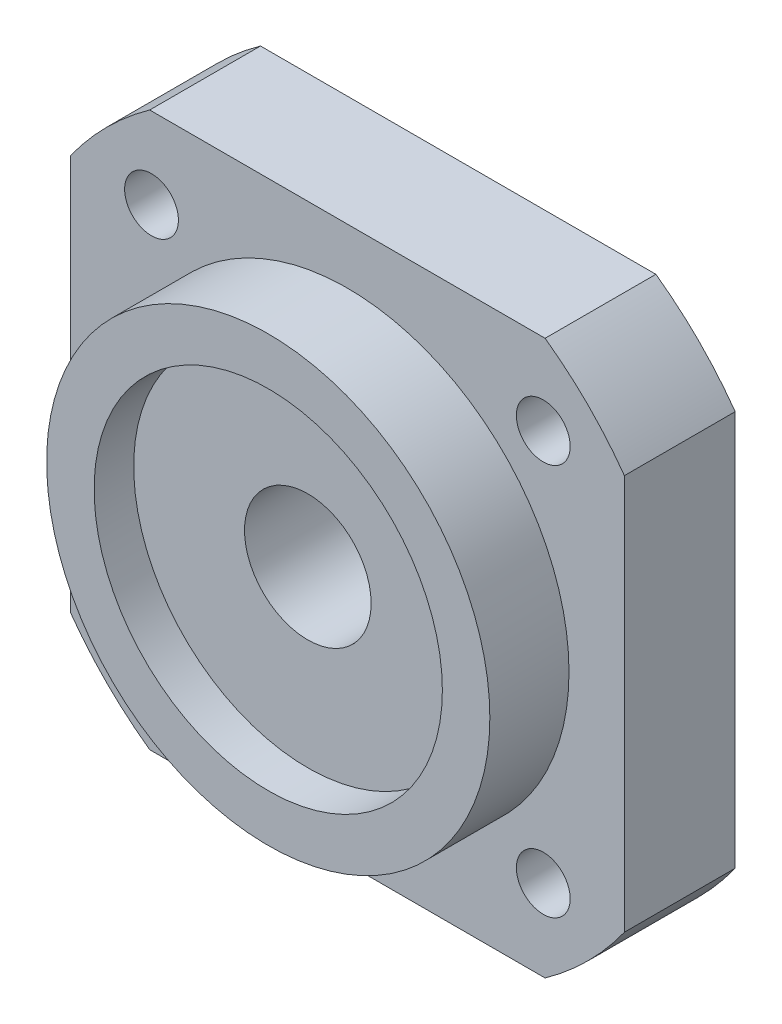
ISO-10303-21;
HEADER;
FILE_DESCRIPTION(('STEP AP214'),'2;1');
FILE_NAME('part.step','',(''),(''),'','','');
FILE_SCHEMA(('AUTOMOTIVE_DESIGN { 1 0 10303 214 1 1 1 1 }'));
ENDSEC;
DATA;
#1=APPLICATION_CONTEXT('core data for automotive mechanical design processes');
#2=APPLICATION_PROTOCOL_DEFINITION('international standard','automotive_design',2000,#1);
#3=PRODUCT_CONTEXT('',#1,'mechanical');
#4=PRODUCT('Part','Part','',(#3));
#5=PRODUCT_RELATED_PRODUCT_CATEGORY('part','',(#4));
#6=PRODUCT_DEFINITION_FORMATION('','',#4);
#7=PRODUCT_DEFINITION_CONTEXT('part definition',#1,'design');
#8=PRODUCT_DEFINITION('design','',#6,#7);
#9=PRODUCT_DEFINITION_SHAPE('','',#8);
#10=(LENGTH_UNIT() NAMED_UNIT(*) SI_UNIT(.MILLI.,.METRE.));
#11=(NAMED_UNIT(*) PLANE_ANGLE_UNIT() SI_UNIT($,.RADIAN.));
#12=(NAMED_UNIT(*) SI_UNIT($,.STERADIAN.) SOLID_ANGLE_UNIT());
#13=UNCERTAINTY_MEASURE_WITH_UNIT(LENGTH_MEASURE(1.E-05),#10,'distance_accuracy_value','');
#14=(GEOMETRIC_REPRESENTATION_CONTEXT(3) GLOBAL_UNCERTAINTY_ASSIGNED_CONTEXT((#13)) GLOBAL_UNIT_ASSIGNED_CONTEXT((#10,
#11,#12)) REPRESENTATION_CONTEXT('',''));
#15=CARTESIAN_POINT('',(0.,0.,0.));
#16=DIRECTION('',(0.,0.,1.));
#17=DIRECTION('',(1.,0.,0.));
#18=AXIS2_PLACEMENT_3D('',#15,#16,#17);
#19=CARTESIAN_POINT('',(0.,0.,7.));
#20=DIRECTION('',(0.,0.,-1.));
#21=DIRECTION('',(-1.,0.,0.));
#22=AXIS2_PLACEMENT_3D('',#19,#20,#21);
#23=CYLINDRICAL_SURFACE('',#22,21.5);
#24=CARTESIAN_POINT('',(0.,0.,0.));
#25=DIRECTION('',(0.,0.,-1.));
#26=DIRECTION('',(-1.,0.,0.));
#27=AXIS2_PLACEMENT_3D('',#24,#25,#26);
#28=CIRCLE('',#27,21.5);
#29=CARTESIAN_POINT('',(12.4899959967968,17.5,0.));
#30=VERTEX_POINT('',#29);
#31=CARTESIAN_POINT('',(17.5,12.4899959967968,0.));
#32=VERTEX_POINT('',#31);
#33=EDGE_CURVE('E132',#30,#32,#28,.T.);
#34=ORIENTED_EDGE('',*,*,#33,.F.);
#35=DIRECTION('',(0.,0.,-1.));
#36=VECTOR('',#35,1.);
#37=CARTESIAN_POINT('',(12.4899959967968,17.5,7.));
#38=LINE('',#37,#36);
#39=CARTESIAN_POINT('',(12.4899959967968,17.5,7.));
#40=VERTEX_POINT('',#39);
#41=EDGE_CURVE('E41',#40,#30,#38,.T.);
#42=ORIENTED_EDGE('',*,*,#41,.F.);
#43=CARTESIAN_POINT('',(0.,0.,7.));
#44=DIRECTION('',(0.,0.,-1.));
#45=DIRECTION('',(-1.,0.,0.));
#46=AXIS2_PLACEMENT_3D('',#43,#44,#45);
#47=CIRCLE('',#46,21.5);
#48=CARTESIAN_POINT('',(17.5,12.4899959967968,7.));
#49=VERTEX_POINT('',#48);
#50=EDGE_CURVE('E154',#40,#49,#47,.T.);
#51=ORIENTED_EDGE('',*,*,#50,.T.);
#52=DIRECTION('',(0.,0.,-1.));
#53=VECTOR('',#52,1.);
#54=CARTESIAN_POINT('',(17.5,12.4899959967968,7.));
#55=LINE('',#54,#53);
#56=EDGE_CURVE('E90',#49,#32,#55,.T.);
#57=ORIENTED_EDGE('',*,*,#56,.T.);
#58=EDGE_LOOP('',(#34,#42,#51,#57));
#59=FACE_BOUND('',#58,.T.);
#60=ADVANCED_FACE('F32',(#59),#23,.T.);
#61=CARTESIAN_POINT('',(-12.4899959967968,17.5,7.));
#62=DIRECTION('',(0.,1.,0.));
#63=DIRECTION('',(-1.,0.,0.));
#64=AXIS2_PLACEMENT_3D('',#61,#62,#63);
#65=PLANE('',#64);
#66=DIRECTION('',(1.,0.,0.));
#67=VECTOR('',#66,1.);
#68=CARTESIAN_POINT('',(-12.4899959967968,17.5,0.));
#69=LINE('',#68,#67);
#70=CARTESIAN_POINT('',(-12.4899959967968,17.5,0.));
#71=VERTEX_POINT('',#70);
#72=EDGE_CURVE('E151',#71,#30,#69,.T.);
#73=ORIENTED_EDGE('',*,*,#72,.F.);
#74=DIRECTION('',(0.,0.,-1.));
#75=VECTOR('',#74,1.);
#76=CARTESIAN_POINT('',(-12.4899959967968,17.5,7.));
#77=LINE('',#76,#75);
#78=CARTESIAN_POINT('',(-12.4899959967968,17.5,7.));
#79=VERTEX_POINT('',#78);
#80=EDGE_CURVE('E78',#79,#71,#77,.T.);
#81=ORIENTED_EDGE('',*,*,#80,.F.);
#82=DIRECTION('',(1.,0.,0.));
#83=VECTOR('',#82,1.);
#84=CARTESIAN_POINT('',(-12.4899959967968,17.5,7.));
#85=LINE('',#84,#83);
#86=EDGE_CURVE('E122',#79,#40,#85,.T.);
#87=ORIENTED_EDGE('',*,*,#86,.T.);
#88=ORIENTED_EDGE('',*,*,#41,.T.);
#89=EDGE_LOOP('',(#73,#81,#87,#88));
#90=FACE_BOUND('',#89,.T.);
#91=ADVANCED_FACE('F241',(#90),#65,.T.);
#92=CARTESIAN_POINT('',(0.,0.,7.));
#93=DIRECTION('',(0.,0.,-1.));
#94=DIRECTION('',(-1.,0.,0.));
#95=AXIS2_PLACEMENT_3D('',#92,#93,#94);
#96=CYLINDRICAL_SURFACE('',#95,21.5);
#97=CARTESIAN_POINT('',(0.,0.,0.));
#98=DIRECTION('',(0.,0.,-1.));
#99=DIRECTION('',(-1.,0.,0.));
#100=AXIS2_PLACEMENT_3D('',#97,#98,#99);
#101=CIRCLE('',#100,21.5);
#102=CARTESIAN_POINT('',(-17.5,12.4899959967968,0.));
#103=VERTEX_POINT('',#102);
#104=EDGE_CURVE('E109',#103,#71,#101,.T.);
#105=ORIENTED_EDGE('',*,*,#104,.F.);
#106=DIRECTION('',(0.,0.,-1.));
#107=VECTOR('',#106,1.);
#108=CARTESIAN_POINT('',(-17.5,12.4899959967968,7.));
#109=LINE('',#108,#107);
#110=CARTESIAN_POINT('',(-17.5,12.4899959967968,7.));
#111=VERTEX_POINT('',#110);
#112=EDGE_CURVE('E104',#111,#103,#109,.T.);
#113=ORIENTED_EDGE('',*,*,#112,.F.);
#114=CARTESIAN_POINT('',(0.,0.,7.));
#115=DIRECTION('',(0.,0.,-1.));
#116=DIRECTION('',(-1.,0.,0.));
#117=AXIS2_PLACEMENT_3D('',#114,#115,#116);
#118=CIRCLE('',#117,21.5);
#119=EDGE_CURVE('E107',#111,#79,#118,.T.);
#120=ORIENTED_EDGE('',*,*,#119,.T.);
#121=ORIENTED_EDGE('',*,*,#80,.T.);
#122=EDGE_LOOP('',(#105,#113,#120,#121));
#123=FACE_BOUND('',#122,.T.);
#124=ADVANCED_FACE('F106',(#123),#96,.T.);
#125=CARTESIAN_POINT('',(-17.5,-12.4899959967968,7.));
#126=DIRECTION('',(-1.,0.,0.));
#127=DIRECTION('',(0.,-1.,0.));
#128=AXIS2_PLACEMENT_3D('',#125,#126,#127);
#129=PLANE('',#128);
#130=DIRECTION('',(0.,1.,0.));
#131=VECTOR('',#130,1.);
#132=CARTESIAN_POINT('',(-17.5,-12.4899959967968,0.));
#133=LINE('',#132,#131);
#134=CARTESIAN_POINT('',(-17.5,-12.4899959967968,0.));
#135=VERTEX_POINT('',#134);
#136=EDGE_CURVE('E148',#135,#103,#133,.T.);
#137=ORIENTED_EDGE('',*,*,#136,.F.);
#138=DIRECTION('',(0.,0.,-1.));
#139=VECTOR('',#138,1.);
#140=CARTESIAN_POINT('',(-17.5,-12.4899959967968,7.));
#141=LINE('',#140,#139);
#142=CARTESIAN_POINT('',(-17.5,-12.4899959967968,7.));
#143=VERTEX_POINT('',#142);
#144=EDGE_CURVE('E114',#143,#135,#141,.T.);
#145=ORIENTED_EDGE('',*,*,#144,.F.);
#146=DIRECTION('',(0.,1.,0.));
#147=VECTOR('',#146,1.);
#148=CARTESIAN_POINT('',(-17.5,-12.4899959967968,7.));
#149=LINE('',#148,#147);
#150=EDGE_CURVE('E120',#143,#111,#149,.T.);
#151=ORIENTED_EDGE('',*,*,#150,.T.);
#152=ORIENTED_EDGE('',*,*,#112,.T.);
#153=EDGE_LOOP('',(#137,#145,#151,#152));
#154=FACE_BOUND('',#153,.T.);
#155=ADVANCED_FACE('F124',(#154),#129,.T.);
#156=CARTESIAN_POINT('',(0.,0.,7.));
#157=DIRECTION('',(0.,0.,-1.));
#158=DIRECTION('',(-1.,0.,0.));
#159=AXIS2_PLACEMENT_3D('',#156,#157,#158);
#160=CYLINDRICAL_SURFACE('',#159,21.5);
#161=CARTESIAN_POINT('',(0.,0.,0.));
#162=DIRECTION('',(0.,0.,-1.));
#163=DIRECTION('',(-1.,0.,0.));
#164=AXIS2_PLACEMENT_3D('',#161,#162,#163);
#165=CIRCLE('',#164,21.5);
#166=CARTESIAN_POINT('',(-12.4899959967968,-17.5,0.));
#167=VERTEX_POINT('',#166);
#168=EDGE_CURVE('E145',#167,#135,#165,.T.);
#169=ORIENTED_EDGE('',*,*,#168,.F.);
#170=DIRECTION('',(0.,0.,-1.));
#171=VECTOR('',#170,1.);
#172=CARTESIAN_POINT('',(-12.4899959967968,-17.5,7.));
#173=LINE('',#172,#171);
#174=CARTESIAN_POINT('',(-12.4899959967968,-17.5,7.));
#175=VERTEX_POINT('',#174);
#176=EDGE_CURVE('E158',#175,#167,#173,.T.);
#177=ORIENTED_EDGE('',*,*,#176,.F.);
#178=CARTESIAN_POINT('',(0.,0.,7.));
#179=DIRECTION('',(0.,0.,-1.));
#180=DIRECTION('',(-1.,0.,0.));
#181=AXIS2_PLACEMENT_3D('',#178,#179,#180);
#182=CIRCLE('',#181,21.5);
#183=EDGE_CURVE('E125',#175,#143,#182,.T.);
#184=ORIENTED_EDGE('',*,*,#183,.T.);
#185=ORIENTED_EDGE('',*,*,#144,.T.);
#186=EDGE_LOOP('',(#169,#177,#184,#185));
#187=FACE_BOUND('',#186,.T.);
#188=ADVANCED_FACE('F254',(#187),#160,.T.);
#189=CARTESIAN_POINT('',(12.4899959967968,-17.5,7.));
#190=DIRECTION('',(0.,-1.,0.));
#191=DIRECTION('',(1.,0.,0.));
#192=AXIS2_PLACEMENT_3D('',#189,#190,#191);
#193=PLANE('',#192);
#194=DIRECTION('',(-1.,0.,0.));
#195=VECTOR('',#194,1.);
#196=CARTESIAN_POINT('',(12.4899959967968,-17.5,0.));
#197=LINE('',#196,#195);
#198=CARTESIAN_POINT('',(12.4899959967968,-17.5,0.));
#199=VERTEX_POINT('',#198);
#200=EDGE_CURVE('E142',#199,#167,#197,.T.);
#201=ORIENTED_EDGE('',*,*,#200,.F.);
#202=DIRECTION('',(0.,0.,-1.));
#203=VECTOR('',#202,1.);
#204=CARTESIAN_POINT('',(12.4899959967968,-17.5,7.));
#205=LINE('',#204,#203);
#206=CARTESIAN_POINT('',(12.4899959967968,-17.5,7.));
#207=VERTEX_POINT('',#206);
#208=EDGE_CURVE('E160',#207,#199,#205,.T.);
#209=ORIENTED_EDGE('',*,*,#208,.F.);
#210=DIRECTION('',(-1.,0.,0.));
#211=VECTOR('',#210,1.);
#212=CARTESIAN_POINT('',(12.4899959967968,-17.5,7.));
#213=LINE('',#212,#211);
#214=EDGE_CURVE('E127',#207,#175,#213,.T.);
#215=ORIENTED_EDGE('',*,*,#214,.T.);
#216=ORIENTED_EDGE('',*,*,#176,.T.);
#217=EDGE_LOOP('',(#201,#209,#215,#216));
#218=FACE_BOUND('',#217,.T.);
#219=ADVANCED_FACE('F232',(#218),#193,.T.);
#220=CARTESIAN_POINT('',(0.,0.,7.));
#221=DIRECTION('',(0.,0.,-1.));
#222=DIRECTION('',(-1.,0.,0.));
#223=AXIS2_PLACEMENT_3D('',#220,#221,#222);
#224=CYLINDRICAL_SURFACE('',#223,21.5);
#225=CARTESIAN_POINT('',(0.,0.,0.));
#226=DIRECTION('',(0.,0.,-1.));
#227=DIRECTION('',(-1.,0.,0.));
#228=AXIS2_PLACEMENT_3D('',#225,#226,#227);
#229=CIRCLE('',#228,21.5);
#230=CARTESIAN_POINT('',(17.5,-12.4899959967968,0.));
#231=VERTEX_POINT('',#230);
#232=EDGE_CURVE('E139',#231,#199,#229,.T.);
#233=ORIENTED_EDGE('',*,*,#232,.F.);
#234=DIRECTION('',(0.,0.,-1.));
#235=VECTOR('',#234,1.);
#236=CARTESIAN_POINT('',(17.5,-12.4899959967968,7.));
#237=LINE('',#236,#235);
#238=CARTESIAN_POINT('',(17.5,-12.4899959967968,7.));
#239=VERTEX_POINT('',#238);
#240=EDGE_CURVE('E162',#239,#231,#237,.T.);
#241=ORIENTED_EDGE('',*,*,#240,.F.);
#242=CARTESIAN_POINT('',(0.,0.,7.));
#243=DIRECTION('',(0.,0.,-1.));
#244=DIRECTION('',(-1.,0.,0.));
#245=AXIS2_PLACEMENT_3D('',#242,#243,#244);
#246=CIRCLE('',#245,21.5);
#247=EDGE_CURVE('E226',#239,#207,#246,.T.);
#248=ORIENTED_EDGE('',*,*,#247,.T.);
#249=ORIENTED_EDGE('',*,*,#208,.T.);
#250=EDGE_LOOP('',(#233,#241,#248,#249));
#251=FACE_BOUND('',#250,.T.);
#252=ADVANCED_FACE('F237',(#251),#224,.T.);
#253=CARTESIAN_POINT('',(17.5,12.4899959967968,7.));
#254=DIRECTION('',(1.,0.,0.));
#255=DIRECTION('',(0.,0.,-1.));
#256=AXIS2_PLACEMENT_3D('',#253,#254,#255);
#257=PLANE('',#256);
#258=DIRECTION('',(0.,-1.,0.));
#259=VECTOR('',#258,1.);
#260=CARTESIAN_POINT('',(17.5,12.4899959967968,0.));
#261=LINE('',#260,#259);
#262=EDGE_CURVE('E135',#32,#231,#261,.T.);
#263=ORIENTED_EDGE('',*,*,#262,.F.);
#264=ORIENTED_EDGE('',*,*,#56,.F.);
#265=DIRECTION('',(0.,-1.,0.));
#266=VECTOR('',#265,1.);
#267=CARTESIAN_POINT('',(17.5,12.4899959967968,7.));
#268=LINE('',#267,#266);
#269=EDGE_CURVE('E224',#49,#239,#268,.T.);
#270=ORIENTED_EDGE('',*,*,#269,.T.);
#271=ORIENTED_EDGE('',*,*,#240,.T.);
#272=EDGE_LOOP('',(#263,#264,#270,#271));
#273=FACE_BOUND('',#272,.T.);
#274=ADVANCED_FACE('F238',(#273),#257,.T.);
#275=CARTESIAN_POINT('',(0.,0.,7.));
#276=DIRECTION('',(0.,0.,-1.));
#277=DIRECTION('',(-1.,0.,0.));
#278=AXIS2_PLACEMENT_3D('',#275,#276,#277);
#279=PLANE('',#278);
#280=CARTESIAN_POINT('',(-12.374368670765,12.374368670765,7.));
#281=DIRECTION('',(0.,0.,-1.));
#282=DIRECTION('',(-1.,0.,0.));
#283=AXIS2_PLACEMENT_3D('',#280,#281,#282);
#284=CIRCLE('',#283,1.70000000000001);
#285=CARTESIAN_POINT('',(-14.074368670765,12.374368670765,7.));
#286=VERTEX_POINT('',#285);
#287=EDGE_CURVE('E35',#286,#286,#284,.T.);
#288=ORIENTED_EDGE('',*,*,#287,.T.);
#289=EDGE_LOOP('',(#288));
#290=FACE_BOUND('',#289,.T.);
#291=CARTESIAN_POINT('',(12.374368670765,12.374368670765,7.));
#292=DIRECTION('',(0.,0.,-1.));
#293=DIRECTION('',(-1.,0.,0.));
#294=AXIS2_PLACEMENT_3D('',#291,#292,#293);
#295=CIRCLE('',#294,1.70000000000001);
#296=CARTESIAN_POINT('',(10.674368670765,12.374368670765,7.));
#297=VERTEX_POINT('',#296);
#298=EDGE_CURVE('E174',#297,#297,#295,.T.);
#299=ORIENTED_EDGE('',*,*,#298,.T.);
#300=EDGE_LOOP('',(#299));
#301=FACE_BOUND('',#300,.T.);
#302=CARTESIAN_POINT('',(12.374368670765,-12.374368670765,7.));
#303=DIRECTION('',(0.,0.,-1.));
#304=DIRECTION('',(-1.,0.,0.));
#305=AXIS2_PLACEMENT_3D('',#302,#303,#304);
#306=CIRCLE('',#305,1.70000000000001);
#307=CARTESIAN_POINT('',(10.674368670765,-12.374368670765,7.));
#308=VERTEX_POINT('',#307);
#309=EDGE_CURVE('E170',#308,#308,#306,.T.);
#310=ORIENTED_EDGE('',*,*,#309,.T.);
#311=EDGE_LOOP('',(#310));
#312=FACE_BOUND('',#311,.T.);
#313=CARTESIAN_POINT('',(-12.374368670765,-12.374368670765,7.));
#314=DIRECTION('',(0.,0.,-1.));
#315=DIRECTION('',(-1.,0.,0.));
#316=AXIS2_PLACEMENT_3D('',#313,#314,#315);
#317=CIRCLE('',#316,1.70000000000001);
#318=CARTESIAN_POINT('',(-14.074368670765,-12.374368670765,7.));
#319=VERTEX_POINT('',#318);
#320=EDGE_CURVE('E165',#319,#319,#317,.T.);
#321=ORIENTED_EDGE('',*,*,#320,.T.);
#322=EDGE_LOOP('',(#321));
#323=FACE_BOUND('',#322,.T.);
#324=CARTESIAN_POINT('',(0.,0.,7.));
#325=DIRECTION('',(0.,0.,1.));
#326=DIRECTION('',(1.,0.,0.));
#327=AXIS2_PLACEMENT_3D('',#324,#325,#326);
#328=CIRCLE('',#327,14.);
#329=CARTESIAN_POINT('',(14.,0.,7.));
#330=VERTEX_POINT('',#329);
#331=EDGE_CURVE('E11',#330,#330,#328,.T.);
#332=ORIENTED_EDGE('',*,*,#331,.F.);
#333=EDGE_LOOP('',(#332));
#334=FACE_BOUND('',#333,.T.);
#335=ORIENTED_EDGE('',*,*,#50,.F.);
#336=ORIENTED_EDGE('',*,*,#86,.F.);
#337=ORIENTED_EDGE('',*,*,#119,.F.);
#338=ORIENTED_EDGE('',*,*,#150,.F.);
#339=ORIENTED_EDGE('',*,*,#183,.F.);
#340=ORIENTED_EDGE('',*,*,#214,.F.);
#341=ORIENTED_EDGE('',*,*,#247,.F.);
#342=ORIENTED_EDGE('',*,*,#269,.F.);
#343=EDGE_LOOP('',(#335,#336,#337,#338,#339,#340,#341,#342));
#344=FACE_BOUND('',#343,.T.);
#345=ADVANCED_FACE('F118',(#290,#301,#312,#323,#334,#344),#279,.F.);
#346=CARTESIAN_POINT('',(0.,0.,0.));
#347=DIRECTION('',(0.,0.,-1.));
#348=DIRECTION('',(-1.,0.,0.));
#349=AXIS2_PLACEMENT_3D('',#346,#347,#348);
#350=PLANE('',#349);
#351=CARTESIAN_POINT('',(-12.374368670765,12.374368670765,0.));
#352=DIRECTION('',(0.,0.,-1.));
#353=DIRECTION('',(-1.,0.,0.));
#354=AXIS2_PLACEMENT_3D('',#351,#352,#353);
#355=CIRCLE('',#354,2.99999999999999);
#356=CARTESIAN_POINT('',(-15.374368670765,12.374368670765,0.));
#357=VERTEX_POINT('',#356);
#358=EDGE_CURVE('E354',#357,#357,#355,.T.);
#359=ORIENTED_EDGE('',*,*,#358,.F.);
#360=EDGE_LOOP('',(#359));
#361=FACE_BOUND('',#360,.T.);
#362=CARTESIAN_POINT('',(12.374368670765,12.374368670765,0.));
#363=DIRECTION('',(0.,0.,-1.));
#364=DIRECTION('',(-1.,0.,0.));
#365=AXIS2_PLACEMENT_3D('',#362,#363,#364);
#366=CIRCLE('',#365,2.99999999999999);
#367=CARTESIAN_POINT('',(9.37436867076501,12.374368670765,0.));
#368=VERTEX_POINT('',#367);
#369=EDGE_CURVE('E189',#368,#368,#366,.T.);
#370=ORIENTED_EDGE('',*,*,#369,.F.);
#371=EDGE_LOOP('',(#370));
#372=FACE_BOUND('',#371,.T.);
#373=CARTESIAN_POINT('',(12.374368670765,-12.374368670765,0.));
#374=DIRECTION('',(0.,0.,-1.));
#375=DIRECTION('',(-1.,0.,0.));
#376=AXIS2_PLACEMENT_3D('',#373,#374,#375);
#377=CIRCLE('',#376,2.99999999999999);
#378=CARTESIAN_POINT('',(9.37436867076501,-12.374368670765,0.));
#379=VERTEX_POINT('',#378);
#380=EDGE_CURVE('E176',#379,#379,#377,.T.);
#381=ORIENTED_EDGE('',*,*,#380,.F.);
#382=EDGE_LOOP('',(#381));
#383=FACE_BOUND('',#382,.T.);
#384=CARTESIAN_POINT('',(-12.374368670765,-12.374368670765,0.));
#385=DIRECTION('',(0.,0.,-1.));
#386=DIRECTION('',(-1.,0.,0.));
#387=AXIS2_PLACEMENT_3D('',#384,#385,#386);
#388=CIRCLE('',#387,2.99999999999999);
#389=CARTESIAN_POINT('',(-15.374368670765,-12.374368670765,0.));
#390=VERTEX_POINT('',#389);
#391=EDGE_CURVE('E172',#390,#390,#388,.T.);
#392=ORIENTED_EDGE('',*,*,#391,.F.);
#393=EDGE_LOOP('',(#392));
#394=FACE_BOUND('',#393,.T.);
#395=CARTESIAN_POINT('',(0.,0.,0.));
#396=DIRECTION('',(0.,0.,1.));
#397=DIRECTION('',(1.,0.,0.));
#398=AXIS2_PLACEMENT_3D('',#395,#396,#397);
#399=CIRCLE('',#398,11.);
#400=CARTESIAN_POINT('',(11.,0.,0.));
#401=VERTEX_POINT('',#400);
#402=EDGE_CURVE('E218',#401,#401,#399,.T.);
#403=ORIENTED_EDGE('',*,*,#402,.T.);
#404=EDGE_LOOP('',(#403));
#405=FACE_BOUND('',#404,.T.);
#406=ORIENTED_EDGE('',*,*,#33,.T.);
#407=ORIENTED_EDGE('',*,*,#262,.T.);
#408=ORIENTED_EDGE('',*,*,#232,.T.);
#409=ORIENTED_EDGE('',*,*,#200,.T.);
#410=ORIENTED_EDGE('',*,*,#168,.T.);
#411=ORIENTED_EDGE('',*,*,#136,.T.);
#412=ORIENTED_EDGE('',*,*,#104,.T.);
#413=ORIENTED_EDGE('',*,*,#72,.T.);
#414=EDGE_LOOP('',(#406,#407,#408,#409,#410,#411,#412,#413));
#415=FACE_BOUND('',#414,.T.);
#416=ADVANCED_FACE('F240',(#361,#372,#383,#394,#405,#415),#350,.T.);
#417=CARTESIAN_POINT('',(0.,0.,7.));
#418=DIRECTION('',(0.,0.,1.));
#419=DIRECTION('',(1.,0.,0.));
#420=AXIS2_PLACEMENT_3D('',#417,#418,#419);
#421=CYLINDRICAL_SURFACE('',#420,14.);
#422=ORIENTED_EDGE('',*,*,#331,.T.);
#423=EDGE_LOOP('',(#422));
#424=FACE_BOUND('',#423,.T.);
#425=CARTESIAN_POINT('',(0.,0.,12.));
#426=DIRECTION('',(0.,0.,1.));
#427=DIRECTION('',(1.,0.,0.));
#428=AXIS2_PLACEMENT_3D('',#425,#426,#427);
#429=CIRCLE('',#428,14.);
#430=CARTESIAN_POINT('',(14.,0.,12.));
#431=VERTEX_POINT('',#430);
#432=EDGE_CURVE('E136',#431,#431,#429,.T.);
#433=ORIENTED_EDGE('',*,*,#432,.F.);
#434=EDGE_LOOP('',(#433));
#435=FACE_BOUND('',#434,.T.);
#436=ADVANCED_FACE('F269',(#424,#435),#421,.T.);
#437=CARTESIAN_POINT('',(0.,0.,12.));
#438=DIRECTION('',(0.,0.,1.));
#439=DIRECTION('',(1.,0.,0.));
#440=AXIS2_PLACEMENT_3D('',#437,#438,#439);
#441=PLANE('',#440);
#442=CARTESIAN_POINT('',(0.,0.,12.));
#443=DIRECTION('',(0.,0.,1.));
#444=DIRECTION('',(1.,0.,0.));
#445=AXIS2_PLACEMENT_3D('',#442,#443,#444);
#446=CIRCLE('',#445,11.);
#447=CARTESIAN_POINT('',(11.,0.,12.));
#448=VERTEX_POINT('',#447);
#449=EDGE_CURVE('E215',#448,#448,#446,.T.);
#450=ORIENTED_EDGE('',*,*,#449,.F.);
#451=EDGE_LOOP('',(#450));
#452=FACE_BOUND('',#451,.T.);
#453=ORIENTED_EDGE('',*,*,#432,.T.);
#454=EDGE_LOOP('',(#453));
#455=FACE_BOUND('',#454,.T.);
#456=ADVANCED_FACE('F275',(#452,#455),#441,.T.);
#457=CARTESIAN_POINT('',(0.,0.,0.));
#458=DIRECTION('',(0.,0.,1.));
#459=DIRECTION('',(1.,0.,0.));
#460=AXIS2_PLACEMENT_3D('',#457,#458,#459);
#461=CYLINDRICAL_SURFACE('',#460,11.);
#462=ORIENTED_EDGE('',*,*,#402,.F.);
#463=EDGE_LOOP('',(#462));
#464=FACE_BOUND('',#463,.T.);
#465=CARTESIAN_POINT('',(0.,0.,2.5));
#466=DIRECTION('',(0.,0.,1.));
#467=DIRECTION('',(1.,0.,0.));
#468=AXIS2_PLACEMENT_3D('',#465,#466,#467);
#469=CIRCLE('',#468,11.);
#470=CARTESIAN_POINT('',(11.,0.,2.5));
#471=VERTEX_POINT('',#470);
#472=EDGE_CURVE('E168',#471,#471,#469,.T.);
#473=ORIENTED_EDGE('',*,*,#472,.T.);
#474=EDGE_LOOP('',(#473));
#475=FACE_BOUND('',#474,.T.);
#476=ADVANCED_FACE('F279',(#464,#475),#461,.F.);
#477=CARTESIAN_POINT('',(0.,0.,0.));
#478=DIRECTION('',(0.,0.,1.));
#479=DIRECTION('',(1.,0.,0.));
#480=AXIS2_PLACEMENT_3D('',#477,#478,#479);
#481=CYLINDRICAL_SURFACE('',#480,11.);
#482=CARTESIAN_POINT('',(0.,0.,9.5));
#483=DIRECTION('',(0.,0.,1.));
#484=DIRECTION('',(1.,0.,0.));
#485=AXIS2_PLACEMENT_3D('',#482,#483,#484);
#486=CIRCLE('',#485,11.);
#487=CARTESIAN_POINT('',(11.,0.,9.5));
#488=VERTEX_POINT('',#487);
#489=EDGE_CURVE('E212',#488,#488,#486,.T.);
#490=ORIENTED_EDGE('',*,*,#489,.F.);
#491=EDGE_LOOP('',(#490));
#492=FACE_BOUND('',#491,.T.);
#493=ORIENTED_EDGE('',*,*,#449,.T.);
#494=EDGE_LOOP('',(#493));
#495=FACE_BOUND('',#494,.T.);
#496=ADVANCED_FACE('F283',(#492,#495),#481,.F.);
#497=CARTESIAN_POINT('',(11.,0.,9.5));
#498=DIRECTION('',(0.,0.,-1.));
#499=DIRECTION('',(-1.,0.,0.));
#500=AXIS2_PLACEMENT_3D('',#497,#498,#499);
#501=PLANE('',#500);
#502=CARTESIAN_POINT('',(0.,0.,9.5));
#503=DIRECTION('',(0.,0.,1.));
#504=DIRECTION('',(1.,0.,0.));
#505=AXIS2_PLACEMENT_3D('',#502,#503,#504);
#506=CIRCLE('',#505,4.);
#507=CARTESIAN_POINT('',(4.,0.,9.5));
#508=VERTEX_POINT('',#507);
#509=EDGE_CURVE('E209',#508,#508,#506,.T.);
#510=ORIENTED_EDGE('',*,*,#509,.F.);
#511=EDGE_LOOP('',(#510));
#512=FACE_BOUND('',#511,.T.);
#513=ORIENTED_EDGE('',*,*,#489,.T.);
#514=EDGE_LOOP('',(#513));
#515=FACE_BOUND('',#514,.T.);
#516=ADVANCED_FACE('F287',(#512,#515),#501,.F.);
#517=CARTESIAN_POINT('',(0.,0.,0.));
#518=DIRECTION('',(0.,0.,1.));
#519=DIRECTION('',(1.,0.,0.));
#520=AXIS2_PLACEMENT_3D('',#517,#518,#519);
#521=CYLINDRICAL_SURFACE('',#520,4.);
#522=CARTESIAN_POINT('',(0.,0.,2.5));
#523=DIRECTION('',(0.,0.,1.));
#524=DIRECTION('',(1.,0.,0.));
#525=AXIS2_PLACEMENT_3D('',#522,#523,#524);
#526=CIRCLE('',#525,4.);
#527=CARTESIAN_POINT('',(4.,0.,2.5));
#528=VERTEX_POINT('',#527);
#529=EDGE_CURVE('E206',#528,#528,#526,.T.);
#530=ORIENTED_EDGE('',*,*,#529,.F.);
#531=EDGE_LOOP('',(#530));
#532=FACE_BOUND('',#531,.T.);
#533=ORIENTED_EDGE('',*,*,#509,.T.);
#534=EDGE_LOOP('',(#533));
#535=FACE_BOUND('',#534,.T.);
#536=ADVANCED_FACE('F291',(#532,#535),#521,.F.);
#537=CARTESIAN_POINT('',(4.,0.,2.5));
#538=DIRECTION('',(0.,0.,1.));
#539=DIRECTION('',(1.,0.,0.));
#540=AXIS2_PLACEMENT_3D('',#537,#538,#539);
#541=PLANE('',#540);
#542=ORIENTED_EDGE('',*,*,#472,.F.);
#543=EDGE_LOOP('',(#542));
#544=FACE_BOUND('',#543,.T.);
#545=ORIENTED_EDGE('',*,*,#529,.T.);
#546=EDGE_LOOP('',(#545));
#547=FACE_BOUND('',#546,.T.);
#548=ADVANCED_FACE('F295',(#544,#547),#541,.F.);
#549=CARTESIAN_POINT('',(-12.374368670765,-12.374368670765,0.));
#550=DIRECTION('',(0.,0.,-1.));
#551=DIRECTION('',(-1.,0.,0.));
#552=AXIS2_PLACEMENT_3D('',#549,#550,#551);
#553=CYLINDRICAL_SURFACE('',#552,1.70000000000001);
#554=CARTESIAN_POINT('',(-12.374368670765,-12.374368670765,3.3));
#555=DIRECTION('',(0.,0.,-1.));
#556=DIRECTION('',(-1.,0.,0.));
#557=AXIS2_PLACEMENT_3D('',#554,#555,#556);
#558=CIRCLE('',#557,1.70000000000001);
#559=CARTESIAN_POINT('',(-14.074368670765,-12.374368670765,3.3));
#560=VERTEX_POINT('',#559);
#561=EDGE_CURVE('E169',#560,#560,#558,.T.);
#562=ORIENTED_EDGE('',*,*,#561,.T.);
#563=EDGE_LOOP('',(#562));
#564=FACE_BOUND('',#563,.T.);
#565=ORIENTED_EDGE('',*,*,#320,.F.);
#566=EDGE_LOOP('',(#565));
#567=FACE_BOUND('',#566,.T.);
#568=ADVANCED_FACE('F299',(#564,#567),#553,.F.);
#569=CARTESIAN_POINT('',(-10.674368670765,-12.374368670765,3.3));
#570=DIRECTION('',(0.,0.,1.));
#571=DIRECTION('',(1.,0.,0.));
#572=AXIS2_PLACEMENT_3D('',#569,#570,#571);
#573=PLANE('',#572);
#574=ORIENTED_EDGE('',*,*,#561,.F.);
#575=EDGE_LOOP('',(#574));
#576=FACE_BOUND('',#575,.T.);
#577=CARTESIAN_POINT('',(-12.374368670765,-12.374368670765,3.3));
#578=DIRECTION('',(0.,0.,-1.));
#579=DIRECTION('',(-1.,0.,0.));
#580=AXIS2_PLACEMENT_3D('',#577,#578,#579);
#581=CIRCLE('',#580,2.99999999999999);
#582=CARTESIAN_POINT('',(-15.374368670765,-12.374368670765,3.3));
#583=VERTEX_POINT('',#582);
#584=EDGE_CURVE('E199',#583,#583,#581,.T.);
#585=ORIENTED_EDGE('',*,*,#584,.T.);
#586=EDGE_LOOP('',(#585));
#587=FACE_BOUND('',#586,.T.);
#588=ADVANCED_FACE('F303',(#576,#587),#573,.F.);
#589=CARTESIAN_POINT('',(-12.374368670765,-12.374368670765,0.));
#590=DIRECTION('',(0.,0.,-1.));
#591=DIRECTION('',(-1.,0.,0.));
#592=AXIS2_PLACEMENT_3D('',#589,#590,#591);
#593=CYLINDRICAL_SURFACE('',#592,2.99999999999999);
#594=ORIENTED_EDGE('',*,*,#584,.F.);
#595=EDGE_LOOP('',(#594));
#596=FACE_BOUND('',#595,.T.);
#597=ORIENTED_EDGE('',*,*,#391,.T.);
#598=EDGE_LOOP('',(#597));
#599=FACE_BOUND('',#598,.T.);
#600=ADVANCED_FACE('F307',(#596,#599),#593,.F.);
#601=CARTESIAN_POINT('',(12.374368670765,-12.374368670765,0.));
#602=DIRECTION('',(0.,0.,-1.));
#603=DIRECTION('',(-1.,0.,0.));
#604=AXIS2_PLACEMENT_3D('',#601,#602,#603);
#605=CYLINDRICAL_SURFACE('',#604,1.70000000000001);
#606=CARTESIAN_POINT('',(12.374368670765,-12.374368670765,3.3));
#607=DIRECTION('',(0.,0.,-1.));
#608=DIRECTION('',(-1.,0.,0.));
#609=AXIS2_PLACEMENT_3D('',#606,#607,#608);
#610=CIRCLE('',#609,1.70000000000001);
#611=CARTESIAN_POINT('',(10.674368670765,-12.374368670765,3.3));
#612=VERTEX_POINT('',#611);
#613=EDGE_CURVE('E173',#612,#612,#610,.T.);
#614=ORIENTED_EDGE('',*,*,#613,.T.);
#615=EDGE_LOOP('',(#614));
#616=FACE_BOUND('',#615,.T.);
#617=ORIENTED_EDGE('',*,*,#309,.F.);
#618=EDGE_LOOP('',(#617));
#619=FACE_BOUND('',#618,.T.);
#620=ADVANCED_FACE('F311',(#616,#619),#605,.F.);
#621=CARTESIAN_POINT('',(14.074368670765,-12.374368670765,3.3));
#622=DIRECTION('',(0.,0.,1.));
#623=DIRECTION('',(1.,0.,0.));
#624=AXIS2_PLACEMENT_3D('',#621,#622,#623);
#625=PLANE('',#624);
#626=ORIENTED_EDGE('',*,*,#613,.F.);
#627=EDGE_LOOP('',(#626));
#628=FACE_BOUND('',#627,.T.);
#629=CARTESIAN_POINT('',(12.374368670765,-12.374368670765,3.3));
#630=DIRECTION('',(0.,0.,-1.));
#631=DIRECTION('',(-1.,0.,0.));
#632=AXIS2_PLACEMENT_3D('',#629,#630,#631);
#633=CIRCLE('',#632,2.99999999999999);
#634=CARTESIAN_POINT('',(9.37436867076501,-12.374368670765,3.3));
#635=VERTEX_POINT('',#634);
#636=EDGE_CURVE('E181',#635,#635,#633,.T.);
#637=ORIENTED_EDGE('',*,*,#636,.T.);
#638=EDGE_LOOP('',(#637));
#639=FACE_BOUND('',#638,.T.);
#640=ADVANCED_FACE('F315',(#628,#639),#625,.F.);
#641=CARTESIAN_POINT('',(12.374368670765,-12.374368670765,0.));
#642=DIRECTION('',(0.,0.,-1.));
#643=DIRECTION('',(-1.,0.,0.));
#644=AXIS2_PLACEMENT_3D('',#641,#642,#643);
#645=CYLINDRICAL_SURFACE('',#644,2.99999999999999);
#646=ORIENTED_EDGE('',*,*,#636,.F.);
#647=EDGE_LOOP('',(#646));
#648=FACE_BOUND('',#647,.T.);
#649=ORIENTED_EDGE('',*,*,#380,.T.);
#650=EDGE_LOOP('',(#649));
#651=FACE_BOUND('',#650,.T.);
#652=ADVANCED_FACE('F319',(#648,#651),#645,.F.);
#653=CARTESIAN_POINT('',(12.374368670765,12.374368670765,0.));
#654=DIRECTION('',(0.,0.,-1.));
#655=DIRECTION('',(-1.,0.,0.));
#656=AXIS2_PLACEMENT_3D('',#653,#654,#655);
#657=CYLINDRICAL_SURFACE('',#656,1.70000000000001);
#658=CARTESIAN_POINT('',(12.374368670765,12.374368670765,3.3));
#659=DIRECTION('',(0.,0.,-1.));
#660=DIRECTION('',(-1.,0.,0.));
#661=AXIS2_PLACEMENT_3D('',#658,#659,#660);
#662=CIRCLE('',#661,1.70000000000001);
#663=CARTESIAN_POINT('',(10.674368670765,12.374368670765,3.3));
#664=VERTEX_POINT('',#663);
#665=EDGE_CURVE('E177',#664,#664,#662,.T.);
#666=ORIENTED_EDGE('',*,*,#665,.T.);
#667=EDGE_LOOP('',(#666));
#668=FACE_BOUND('',#667,.T.);
#669=ORIENTED_EDGE('',*,*,#298,.F.);
#670=EDGE_LOOP('',(#669));
#671=FACE_BOUND('',#670,.T.);
#672=ADVANCED_FACE('F323',(#668,#671),#657,.F.);
#673=CARTESIAN_POINT('',(14.074368670765,12.374368670765,3.3));
#674=DIRECTION('',(0.,0.,1.));
#675=DIRECTION('',(1.,0.,0.));
#676=AXIS2_PLACEMENT_3D('',#673,#674,#675);
#677=PLANE('',#676);
#678=ORIENTED_EDGE('',*,*,#665,.F.);
#679=EDGE_LOOP('',(#678));
#680=FACE_BOUND('',#679,.T.);
#681=CARTESIAN_POINT('',(12.374368670765,12.374368670765,3.3));
#682=DIRECTION('',(0.,0.,-1.));
#683=DIRECTION('',(-1.,0.,0.));
#684=AXIS2_PLACEMENT_3D('',#681,#682,#683);
#685=CIRCLE('',#684,2.99999999999999);
#686=CARTESIAN_POINT('',(9.37436867076501,12.374368670765,3.3));
#687=VERTEX_POINT('',#686);
#688=EDGE_CURVE('E184',#687,#687,#685,.T.);
#689=ORIENTED_EDGE('',*,*,#688,.T.);
#690=EDGE_LOOP('',(#689));
#691=FACE_BOUND('',#690,.T.);
#692=ADVANCED_FACE('F327',(#680,#691),#677,.F.);
#693=CARTESIAN_POINT('',(12.374368670765,12.374368670765,0.));
#694=DIRECTION('',(0.,0.,-1.));
#695=DIRECTION('',(-1.,0.,0.));
#696=AXIS2_PLACEMENT_3D('',#693,#694,#695);
#697=CYLINDRICAL_SURFACE('',#696,2.99999999999999);
#698=ORIENTED_EDGE('',*,*,#688,.F.);
#699=EDGE_LOOP('',(#698));
#700=FACE_BOUND('',#699,.T.);
#701=ORIENTED_EDGE('',*,*,#369,.T.);
#702=EDGE_LOOP('',(#701));
#703=FACE_BOUND('',#702,.T.);
#704=ADVANCED_FACE('F330',(#700,#703),#697,.F.);
#705=CARTESIAN_POINT('',(-12.374368670765,12.374368670765,0.));
#706=DIRECTION('',(0.,0.,-1.));
#707=DIRECTION('',(-1.,0.,0.));
#708=AXIS2_PLACEMENT_3D('',#705,#706,#707);
#709=CYLINDRICAL_SURFACE('',#708,1.70000000000001);
#710=CARTESIAN_POINT('',(-12.374368670765,12.374368670765,3.3));
#711=DIRECTION('',(0.,0.,-1.));
#712=DIRECTION('',(-1.,0.,0.));
#713=AXIS2_PLACEMENT_3D('',#710,#711,#712);
#714=CIRCLE('',#713,1.70000000000001);
#715=CARTESIAN_POINT('',(-14.074368670765,12.374368670765,3.3));
#716=VERTEX_POINT('',#715);
#717=EDGE_CURVE('E356',#716,#716,#714,.T.);
#718=ORIENTED_EDGE('',*,*,#717,.T.);
#719=EDGE_LOOP('',(#718));
#720=FACE_BOUND('',#719,.T.);
#721=ORIENTED_EDGE('',*,*,#287,.F.);
#722=EDGE_LOOP('',(#721));
#723=FACE_BOUND('',#722,.T.);
#724=ADVANCED_FACE('F334',(#720,#723),#709,.F.);
#725=CARTESIAN_POINT('',(-10.674368670765,12.374368670765,3.3));
#726=DIRECTION('',(0.,0.,1.));
#727=DIRECTION('',(1.,0.,0.));
#728=AXIS2_PLACEMENT_3D('',#725,#726,#727);
#729=PLANE('',#728);
#730=ORIENTED_EDGE('',*,*,#717,.F.);
#731=EDGE_LOOP('',(#730));
#732=FACE_BOUND('',#731,.T.);
#733=CARTESIAN_POINT('',(-12.374368670765,12.374368670765,3.3));
#734=DIRECTION('',(0.,0.,-1.));
#735=DIRECTION('',(-1.,0.,0.));
#736=AXIS2_PLACEMENT_3D('',#733,#734,#735);
#737=CIRCLE('',#736,2.99999999999999);
#738=CARTESIAN_POINT('',(-15.374368670765,12.374368670765,3.3));
#739=VERTEX_POINT('',#738);
#740=EDGE_CURVE('E351',#739,#739,#737,.T.);
#741=ORIENTED_EDGE('',*,*,#740,.T.);
#742=EDGE_LOOP('',(#741));
#743=FACE_BOUND('',#742,.T.);
#744=ADVANCED_FACE('F338',(#732,#743),#729,.F.);
#745=CARTESIAN_POINT('',(-12.374368670765,12.374368670765,0.));
#746=DIRECTION('',(0.,0.,-1.));
#747=DIRECTION('',(-1.,0.,0.));
#748=AXIS2_PLACEMENT_3D('',#745,#746,#747);
#749=CYLINDRICAL_SURFACE('',#748,2.99999999999999);
#750=ORIENTED_EDGE('',*,*,#740,.F.);
#751=EDGE_LOOP('',(#750));
#752=FACE_BOUND('',#751,.T.);
#753=ORIENTED_EDGE('',*,*,#358,.T.);
#754=EDGE_LOOP('',(#753));
#755=FACE_BOUND('',#754,.T.);
#756=ADVANCED_FACE('F342',(#752,#755),#749,.F.);
#757=CLOSED_SHELL('',(#60,#91,#124,#155,#188,#219,#252,#274,#345,#416,#436,#456,#476,#496,#516,
#536,#548,#568,#588,#600,#620,#640,#652,#672,#692,#704,#724,#744,#756));
#758=MANIFOLD_SOLID_BREP('B2',#757);
#759=ADVANCED_BREP_SHAPE_REPRESENTATION('',(#18,#758),#14);
#760=SHAPE_DEFINITION_REPRESENTATION(#9,#759);
ENDSEC;
END-ISO-10303-21;
